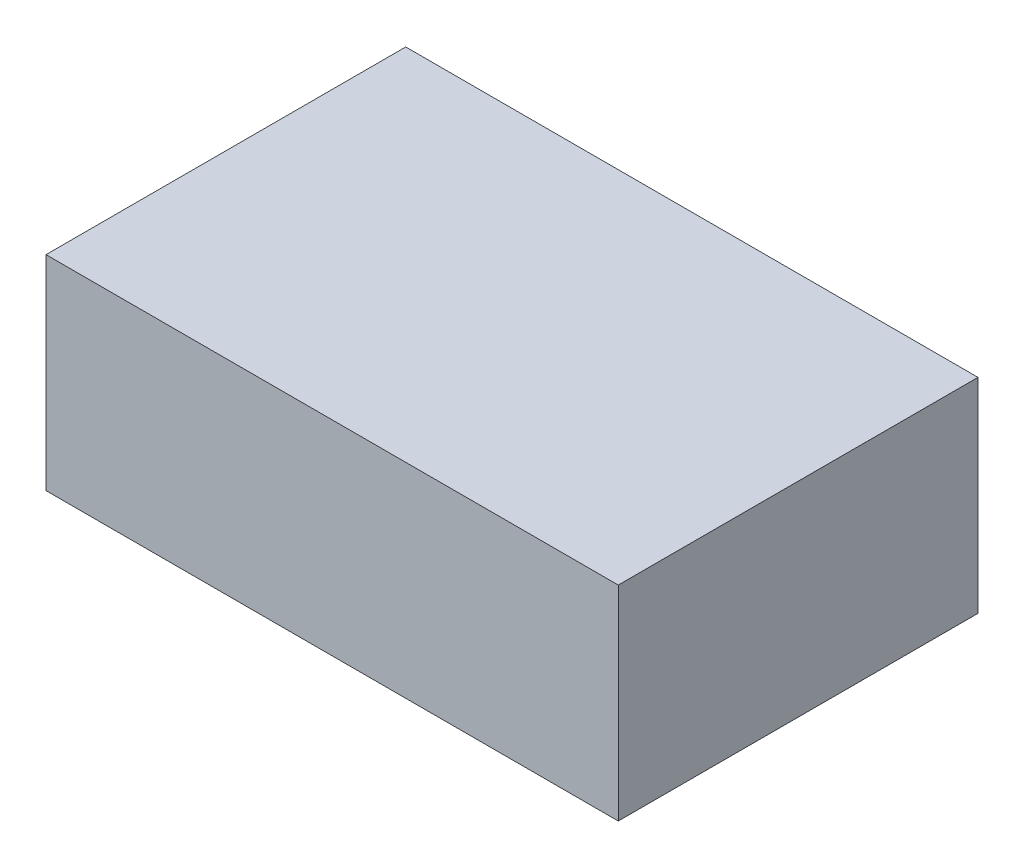
ISO-10303-21;
HEADER;
FILE_DESCRIPTION(('STEP AP214'),'2;1');
FILE_NAME('part.step','',(''),(''),'','','');
FILE_SCHEMA(('AUTOMOTIVE_DESIGN { 1 0 10303 214 1 1 1 1 }'));
ENDSEC;
DATA;
#1=APPLICATION_CONTEXT('core data for automotive mechanical design processes');
#2=APPLICATION_PROTOCOL_DEFINITION('international standard','automotive_design',2000,#1);
#3=PRODUCT_CONTEXT('',#1,'mechanical');
#4=PRODUCT('Part','Part','',(#3));
#5=PRODUCT_RELATED_PRODUCT_CATEGORY('part','',(#4));
#6=PRODUCT_DEFINITION_FORMATION('','',#4);
#7=PRODUCT_DEFINITION_CONTEXT('part definition',#1,'design');
#8=PRODUCT_DEFINITION('design','',#6,#7);
#9=PRODUCT_DEFINITION_SHAPE('','',#8);
#10=(LENGTH_UNIT() NAMED_UNIT(*) SI_UNIT(.MILLI.,.METRE.));
#11=(NAMED_UNIT(*) PLANE_ANGLE_UNIT() SI_UNIT($,.RADIAN.));
#12=(NAMED_UNIT(*) SI_UNIT($,.STERADIAN.) SOLID_ANGLE_UNIT());
#13=UNCERTAINTY_MEASURE_WITH_UNIT(LENGTH_MEASURE(1.E-05),#10,'distance_accuracy_value','');
#14=(GEOMETRIC_REPRESENTATION_CONTEXT(3) GLOBAL_UNCERTAINTY_ASSIGNED_CONTEXT((#13)) GLOBAL_UNIT_ASSIGNED_CONTEXT((#10,
#11,#12)) REPRESENTATION_CONTEXT('',''));
#15=CARTESIAN_POINT('',(0.,0.,0.));
#16=DIRECTION('',(0.,0.,1.));
#17=DIRECTION('',(1.,0.,0.));
#18=AXIS2_PLACEMENT_3D('',#15,#16,#17);
#19=CARTESIAN_POINT('',(7.84,1.75,3.31));
#20=DIRECTION('',(-1.,0.,0.));
#21=DIRECTION('',(0.,0.,1.));
#22=AXIS2_PLACEMENT_3D('',#19,#20,#21);
#23=PLANE('',#22);
#24=DIRECTION('',(0.,0.,-1.));
#25=VECTOR('',#24,1.);
#26=CARTESIAN_POINT('',(7.84,1.75,4.19));
#27=LINE('',#26,#25);
#28=CARTESIAN_POINT('',(7.84,1.75,4.19));
#29=VERTEX_POINT('',#28);
#30=CARTESIAN_POINT('',(7.84,1.75,3.31));
#31=VERTEX_POINT('',#30);
#32=EDGE_CURVE('E35',#29,#31,#27,.T.);
#33=ORIENTED_EDGE('',*,*,#32,.F.);
#34=DIRECTION('',(0.,1.,0.));
#35=VECTOR('',#34,1.);
#36=CARTESIAN_POINT('',(7.84,1.75,4.19));
#37=LINE('',#36,#35);
#38=CARTESIAN_POINT('',(7.84,2.25,4.19));
#39=VERTEX_POINT('',#38);
#40=EDGE_CURVE('E11',#29,#39,#37,.T.);
#41=ORIENTED_EDGE('',*,*,#40,.T.);
#42=DIRECTION('',(0.,0.,1.));
#43=VECTOR('',#42,1.);
#44=CARTESIAN_POINT('',(7.84,2.25,4.19));
#45=LINE('',#44,#43);
#46=CARTESIAN_POINT('',(7.84,2.25,3.31));
#47=VERTEX_POINT('',#46);
#48=EDGE_CURVE('E79',#47,#39,#45,.T.);
#49=ORIENTED_EDGE('',*,*,#48,.F.);
#50=DIRECTION('',(0.,1.,0.));
#51=VECTOR('',#50,1.);
#52=CARTESIAN_POINT('',(7.84,1.75,3.31));
#53=LINE('',#52,#51);
#54=EDGE_CURVE('E27',#31,#47,#53,.T.);
#55=ORIENTED_EDGE('',*,*,#54,.F.);
#56=EDGE_LOOP('',(#33,#41,#49,#55));
#57=FACE_BOUND('',#56,.T.);
#58=ADVANCED_FACE('F17',(#57),#23,.T.);
#59=CARTESIAN_POINT('',(9.24,1.75,3.31));
#60=DIRECTION('',(0.,0.,-1.));
#61=DIRECTION('',(-1.,0.,0.));
#62=AXIS2_PLACEMENT_3D('',#59,#60,#61);
#63=PLANE('',#62);
#64=DIRECTION('',(1.,0.,0.));
#65=VECTOR('',#64,1.);
#66=CARTESIAN_POINT('',(7.84,1.75,3.31));
#67=LINE('',#66,#65);
#68=CARTESIAN_POINT('',(9.24,1.75,3.31));
#69=VERTEX_POINT('',#68);
#70=EDGE_CURVE('E82',#31,#69,#67,.T.);
#71=ORIENTED_EDGE('',*,*,#70,.F.);
#72=ORIENTED_EDGE('',*,*,#54,.T.);
#73=DIRECTION('',(-1.,0.,0.));
#74=VECTOR('',#73,1.);
#75=CARTESIAN_POINT('',(7.84,2.25,3.31));
#76=LINE('',#75,#74);
#77=CARTESIAN_POINT('',(9.24,2.25,3.31));
#78=VERTEX_POINT('',#77);
#79=EDGE_CURVE('E71',#78,#47,#76,.T.);
#80=ORIENTED_EDGE('',*,*,#79,.F.);
#81=DIRECTION('',(0.,1.,0.));
#82=VECTOR('',#81,1.);
#83=CARTESIAN_POINT('',(9.24,1.75,3.31));
#84=LINE('',#83,#82);
#85=EDGE_CURVE('E67',#69,#78,#84,.T.);
#86=ORIENTED_EDGE('',*,*,#85,.F.);
#87=EDGE_LOOP('',(#71,#72,#80,#86));
#88=FACE_BOUND('',#87,.T.);
#89=ADVANCED_FACE('F91',(#88),#63,.T.);
#90=CARTESIAN_POINT('',(9.24,1.75,4.19));
#91=DIRECTION('',(1.,0.,0.));
#92=DIRECTION('',(0.,0.,-1.));
#93=AXIS2_PLACEMENT_3D('',#90,#91,#92);
#94=PLANE('',#93);
#95=DIRECTION('',(0.,0.,1.));
#96=VECTOR('',#95,1.);
#97=CARTESIAN_POINT('',(9.24,1.75,3.31));
#98=LINE('',#97,#96);
#99=CARTESIAN_POINT('',(9.24,1.75,4.19));
#100=VERTEX_POINT('',#99);
#101=EDGE_CURVE('E55',#69,#100,#98,.T.);
#102=ORIENTED_EDGE('',*,*,#101,.F.);
#103=ORIENTED_EDGE('',*,*,#85,.T.);
#104=DIRECTION('',(0.,0.,-1.));
#105=VECTOR('',#104,1.);
#106=CARTESIAN_POINT('',(9.24,2.25,3.31));
#107=LINE('',#106,#105);
#108=CARTESIAN_POINT('',(9.24,2.25,4.19));
#109=VERTEX_POINT('',#108);
#110=EDGE_CURVE('E61',#109,#78,#107,.T.);
#111=ORIENTED_EDGE('',*,*,#110,.F.);
#112=DIRECTION('',(0.,1.,0.));
#113=VECTOR('',#112,1.);
#114=CARTESIAN_POINT('',(9.24,1.75,4.19));
#115=LINE('',#114,#113);
#116=EDGE_CURVE('E64',#100,#109,#115,.T.);
#117=ORIENTED_EDGE('',*,*,#116,.F.);
#118=EDGE_LOOP('',(#102,#103,#111,#117));
#119=FACE_BOUND('',#118,.T.);
#120=ADVANCED_FACE('F63',(#119),#94,.T.);
#121=CARTESIAN_POINT('',(7.84,1.75,4.19));
#122=DIRECTION('',(0.,0.,1.));
#123=DIRECTION('',(1.,0.,0.));
#124=AXIS2_PLACEMENT_3D('',#121,#122,#123);
#125=PLANE('',#124);
#126=DIRECTION('',(-1.,0.,0.));
#127=VECTOR('',#126,1.);
#128=CARTESIAN_POINT('',(9.24,1.75,4.19));
#129=LINE('',#128,#127);
#130=EDGE_CURVE('E76',#100,#29,#129,.T.);
#131=ORIENTED_EDGE('',*,*,#130,.F.);
#132=ORIENTED_EDGE('',*,*,#116,.T.);
#133=DIRECTION('',(1.,0.,0.));
#134=VECTOR('',#133,1.);
#135=CARTESIAN_POINT('',(9.24,2.25,4.19));
#136=LINE('',#135,#134);
#137=EDGE_CURVE('E21',#39,#109,#136,.T.);
#138=ORIENTED_EDGE('',*,*,#137,.F.);
#139=ORIENTED_EDGE('',*,*,#40,.F.);
#140=EDGE_LOOP('',(#131,#132,#138,#139));
#141=FACE_BOUND('',#140,.T.);
#142=ADVANCED_FACE('F75',(#141),#125,.T.);
#143=CARTESIAN_POINT('',(8.54,2.25,3.75));
#144=DIRECTION('',(0.,1.,0.));
#145=DIRECTION('',(0.,0.,1.));
#146=AXIS2_PLACEMENT_3D('',#143,#144,#145);
#147=PLANE('',#146);
#148=ORIENTED_EDGE('',*,*,#137,.T.);
#149=ORIENTED_EDGE('',*,*,#110,.T.);
#150=ORIENTED_EDGE('',*,*,#79,.T.);
#151=ORIENTED_EDGE('',*,*,#48,.T.);
#152=EDGE_LOOP('',(#148,#149,#150,#151));
#153=FACE_BOUND('',#152,.T.);
#154=ADVANCED_FACE('F78',(#153),#147,.T.);
#155=CARTESIAN_POINT('',(8.54,1.75,3.75));
#156=DIRECTION('',(0.,1.,0.));
#157=DIRECTION('',(-1.,0.,0.));
#158=AXIS2_PLACEMENT_3D('',#155,#156,#157);
#159=PLANE('',#158);
#160=ORIENTED_EDGE('',*,*,#130,.T.);
#161=ORIENTED_EDGE('',*,*,#32,.T.);
#162=ORIENTED_EDGE('',*,*,#70,.T.);
#163=ORIENTED_EDGE('',*,*,#101,.T.);
#164=EDGE_LOOP('',(#160,#161,#162,#163));
#165=FACE_BOUND('',#164,.T.);
#166=ADVANCED_FACE('F19',(#165),#159,.F.);
#167=CLOSED_SHELL('',(#58,#89,#120,#142,#154,#166));
#168=MANIFOLD_SOLID_BREP('B1',#167);
#169=ADVANCED_BREP_SHAPE_REPRESENTATION('',(#18,#168),#14);
#170=SHAPE_DEFINITION_REPRESENTATION(#9,#169);
ENDSEC;
END-ISO-10303-21;
